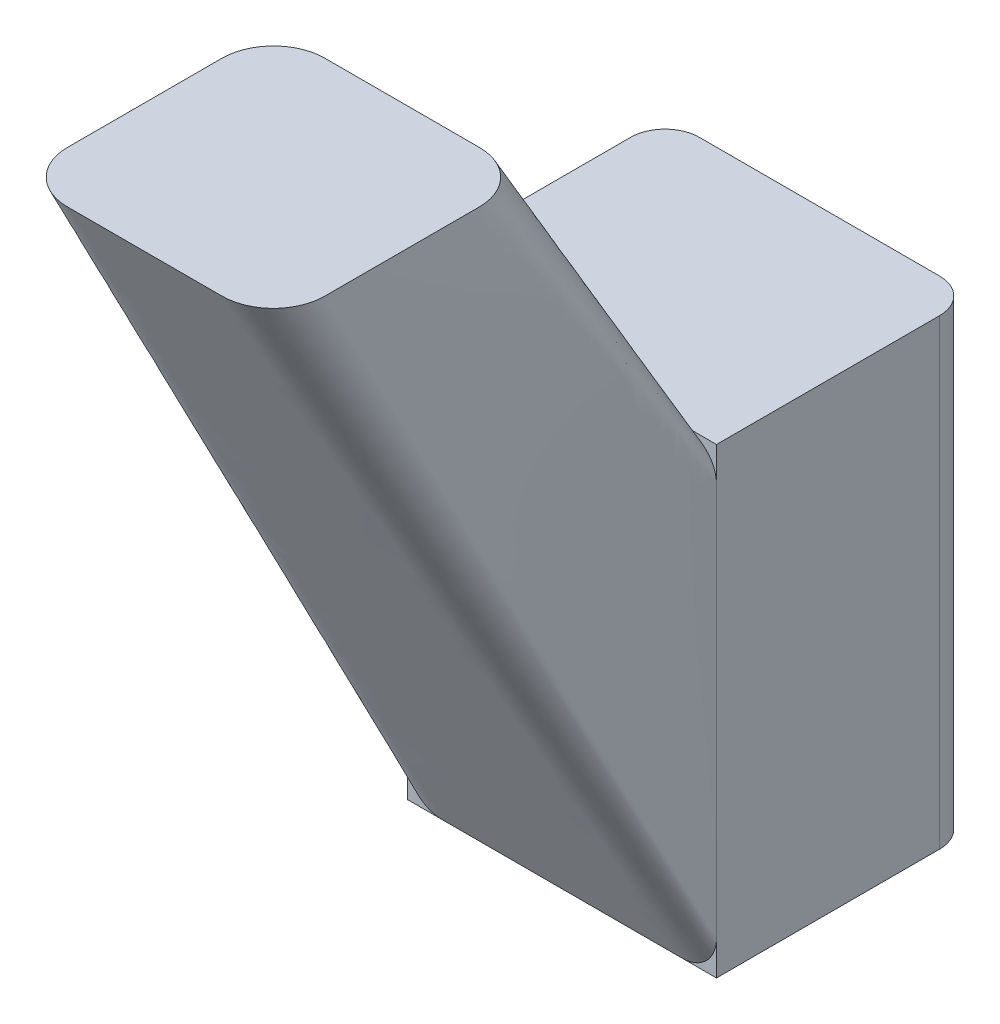
ISO-10303-21;
HEADER;
FILE_DESCRIPTION(('STEP AP214'),'2;1');
FILE_NAME('part.step','',(''),(''),'','','');
FILE_SCHEMA(('AUTOMOTIVE_DESIGN { 1 0 10303 214 1 1 1 1 }'));
ENDSEC;
DATA;
#1=APPLICATION_CONTEXT('core data for automotive mechanical design processes');
#2=APPLICATION_PROTOCOL_DEFINITION('international standard','automotive_design',2000,#1);
#3=PRODUCT_CONTEXT('',#1,'mechanical');
#4=PRODUCT('Part','Part','',(#3));
#5=PRODUCT_RELATED_PRODUCT_CATEGORY('part','',(#4));
#6=PRODUCT_DEFINITION_FORMATION('','',#4);
#7=PRODUCT_DEFINITION_CONTEXT('part definition',#1,'design');
#8=PRODUCT_DEFINITION('design','',#6,#7);
#9=PRODUCT_DEFINITION_SHAPE('','',#8);
#10=(LENGTH_UNIT() NAMED_UNIT(*) SI_UNIT(.MILLI.,.METRE.));
#11=(NAMED_UNIT(*) PLANE_ANGLE_UNIT() SI_UNIT($,.RADIAN.));
#12=(NAMED_UNIT(*) SI_UNIT($,.STERADIAN.) SOLID_ANGLE_UNIT());
#13=UNCERTAINTY_MEASURE_WITH_UNIT(LENGTH_MEASURE(1.E-05),#10,'distance_accuracy_value','');
#14=(GEOMETRIC_REPRESENTATION_CONTEXT(3) GLOBAL_UNCERTAINTY_ASSIGNED_CONTEXT((#13)) GLOBAL_UNIT_ASSIGNED_CONTEXT((#10,
#11,#12)) REPRESENTATION_CONTEXT('',''));
#15=CARTESIAN_POINT('',(0.,0.,0.));
#16=DIRECTION('',(0.,0.,1.));
#17=DIRECTION('',(1.,0.,0.));
#18=AXIS2_PLACEMENT_3D('',#15,#16,#17);
#19=CARTESIAN_POINT('',(0.,26.92,-9.));
#20=DIRECTION('',(0.,0.,-1.));
#21=DIRECTION('',(-1.,0.,0.));
#22=AXIS2_PLACEMENT_3D('',#19,#20,#21);
#23=PLANE('',#22);
#24=DIRECTION('',(0.,-1.,0.));
#25=VECTOR('',#24,1.);
#26=CARTESIAN_POINT('',(-9.,26.92,-9.));
#27=LINE('',#26,#25);
#28=CARTESIAN_POINT('',(-9.,26.92,-9.));
#29=VERTEX_POINT('',#28);
#30=CARTESIAN_POINT('',(-9.,24.92,-9.));
#31=VERTEX_POINT('',#30);
#32=EDGE_CURVE('E361',#29,#31,#27,.T.);
#33=ORIENTED_EDGE('',*,*,#32,.T.);
#34=CARTESIAN_POINT('',(-7.,24.92,-9.));
#35=DIRECTION('',(0.,0.,1.));
#36=DIRECTION('',(1.,0.,0.));
#37=AXIS2_PLACEMENT_3D('',#34,#35,#36);
#38=CIRCLE('',#37,2.);
#39=CARTESIAN_POINT('',(-6.99999999999999,26.92,-9.));
#40=VERTEX_POINT('',#39);
#41=EDGE_CURVE('E580',#40,#31,#38,.T.);
#42=ORIENTED_EDGE('',*,*,#41,.F.);
#43=DIRECTION('',(1.,0.,0.));
#44=VECTOR('',#43,1.);
#45=CARTESIAN_POINT('',(0.,26.92,-9.));
#46=LINE('',#45,#44);
#47=EDGE_CURVE('E320',#29,#40,#46,.T.);
#48=ORIENTED_EDGE('',*,*,#47,.F.);
#49=EDGE_LOOP('',(#33,#42,#48));
#50=FACE_BOUND('',#49,.T.);
#51=ADVANCED_FACE('F234',(#50),#23,.F.);
#52=CARTESIAN_POINT('',(6.99999999999999,26.92,-9.));
#53=VERTEX_POINT('',#52);
#54=CARTESIAN_POINT('',(9.,26.92,-9.));
#55=VERTEX_POINT('',#54);
#56=EDGE_CURVE('E304',#53,#55,#46,.T.);
#57=ORIENTED_EDGE('',*,*,#56,.F.);
#58=CARTESIAN_POINT('',(7.,24.92,-9.));
#59=DIRECTION('',(0.,0.,1.));
#60=DIRECTION('',(1.,0.,0.));
#61=AXIS2_PLACEMENT_3D('',#58,#59,#60);
#62=CIRCLE('',#61,2.);
#63=CARTESIAN_POINT('',(9.,24.92,-9.));
#64=VERTEX_POINT('',#63);
#65=EDGE_CURVE('E324',#64,#53,#62,.T.);
#66=ORIENTED_EDGE('',*,*,#65,.F.);
#67=DIRECTION('',(0.,-1.,0.));
#68=VECTOR('',#67,1.);
#69=CARTESIAN_POINT('',(9.,26.92,-9.));
#70=LINE('',#69,#68);
#71=EDGE_CURVE('E321',#55,#64,#70,.T.);
#72=ORIENTED_EDGE('',*,*,#71,.F.);
#73=EDGE_LOOP('',(#57,#66,#72));
#74=FACE_BOUND('',#73,.T.);
#75=ADVANCED_FACE('F325',(#74),#23,.F.);
#76=CARTESIAN_POINT('',(9.,2.00000000000001,-9.));
#77=VERTEX_POINT('',#76);
#78=CARTESIAN_POINT('',(9.,0.,-9.));
#79=VERTEX_POINT('',#78);
#80=EDGE_CURVE('E329',#77,#79,#70,.T.);
#81=ORIENTED_EDGE('',*,*,#80,.F.);
#82=CARTESIAN_POINT('',(7.,2.,-9.));
#83=DIRECTION('',(0.,0.,1.));
#84=DIRECTION('',(1.,0.,0.));
#85=AXIS2_PLACEMENT_3D('',#82,#83,#84);
#86=CIRCLE('',#85,2.);
#87=CARTESIAN_POINT('',(6.99999999999998,0.,-9.));
#88=VERTEX_POINT('',#87);
#89=EDGE_CURVE('E429',#88,#77,#86,.T.);
#90=ORIENTED_EDGE('',*,*,#89,.F.);
#91=DIRECTION('',(1.,0.,0.));
#92=VECTOR('',#91,1.);
#93=CARTESIAN_POINT('',(0.,0.,-9.));
#94=LINE('',#93,#92);
#95=EDGE_CURVE('E348',#88,#79,#94,.T.);
#96=ORIENTED_EDGE('',*,*,#95,.T.);
#97=EDGE_LOOP('',(#81,#90,#96));
#98=FACE_BOUND('',#97,.T.);
#99=ADVANCED_FACE('F393',(#98),#23,.F.);
#100=CARTESIAN_POINT('',(0.,26.92,-24.));
#101=DIRECTION('',(0.,0.,-1.));
#102=DIRECTION('',(-1.,0.,0.));
#103=AXIS2_PLACEMENT_3D('',#100,#101,#102);
#104=PLANE('',#103);
#105=DIRECTION('',(1.,0.,0.));
#106=VECTOR('',#105,1.);
#107=CARTESIAN_POINT('',(0.,0.,-24.));
#108=LINE('',#107,#106);
#109=CARTESIAN_POINT('',(-6.99999999999999,0.,-24.));
#110=VERTEX_POINT('',#109);
#111=CARTESIAN_POINT('',(6.99999999999999,0.,-24.));
#112=VERTEX_POINT('',#111);
#113=EDGE_CURVE('E345',#110,#112,#108,.T.);
#114=ORIENTED_EDGE('',*,*,#113,.F.);
#115=DIRECTION('',(0.,-1.,0.));
#116=VECTOR('',#115,1.);
#117=CARTESIAN_POINT('',(-6.99999999999999,26.92,-24.));
#118=LINE('',#117,#116);
#119=CARTESIAN_POINT('',(-6.99999999999999,26.92,-24.));
#120=VERTEX_POINT('',#119);
#121=EDGE_CURVE('E12',#120,#110,#118,.T.);
#122=ORIENTED_EDGE('',*,*,#121,.F.);
#123=DIRECTION('',(1.,0.,0.));
#124=VECTOR('',#123,1.);
#125=CARTESIAN_POINT('',(0.,26.92,-24.));
#126=LINE('',#125,#124);
#127=CARTESIAN_POINT('',(6.99999999999999,26.92,-24.));
#128=VERTEX_POINT('',#127);
#129=EDGE_CURVE('E379',#120,#128,#126,.T.);
#130=ORIENTED_EDGE('',*,*,#129,.T.);
#131=DIRECTION('',(0.,-1.,0.));
#132=VECTOR('',#131,1.);
#133=CARTESIAN_POINT('',(6.99999999999999,26.92,-24.));
#134=LINE('',#133,#132);
#135=EDGE_CURVE('E287',#128,#112,#134,.T.);
#136=ORIENTED_EDGE('',*,*,#135,.T.);
#137=EDGE_LOOP('',(#114,#122,#130,#136));
#138=FACE_BOUND('',#137,.T.);
#139=ADVANCED_FACE('F240',(#138),#104,.T.);
#140=CARTESIAN_POINT('',(-7.,26.92,-22.));
#141=DIRECTION('',(0.,-1.,0.));
#142=DIRECTION('',(0.,0.,-1.));
#143=AXIS2_PLACEMENT_3D('',#140,#141,#142);
#144=CYLINDRICAL_SURFACE('',#143,2.);
#145=CARTESIAN_POINT('',(-7.,0.,-22.));
#146=DIRECTION('',(0.,1.,0.));
#147=DIRECTION('',(0.,0.,1.));
#148=AXIS2_PLACEMENT_3D('',#145,#146,#147);
#149=CIRCLE('',#148,2.);
#150=CARTESIAN_POINT('',(-9.,0.,-22.));
#151=VERTEX_POINT('',#150);
#152=EDGE_CURVE('E344',#110,#151,#149,.T.);
#153=ORIENTED_EDGE('',*,*,#152,.T.);
#154=DIRECTION('',(0.,-1.,0.));
#155=VECTOR('',#154,1.);
#156=CARTESIAN_POINT('',(-9.,26.92,-22.));
#157=LINE('',#156,#155);
#158=CARTESIAN_POINT('',(-9.,26.92,-22.));
#159=VERTEX_POINT('',#158);
#160=EDGE_CURVE('E241',#159,#151,#157,.T.);
#161=ORIENTED_EDGE('',*,*,#160,.F.);
#162=CARTESIAN_POINT('',(-7.,26.92,-22.));
#163=DIRECTION('',(0.,1.,0.));
#164=DIRECTION('',(0.,0.,1.));
#165=AXIS2_PLACEMENT_3D('',#162,#163,#164);
#166=CIRCLE('',#165,2.);
#167=EDGE_CURVE('E381',#120,#159,#166,.T.);
#168=ORIENTED_EDGE('',*,*,#167,.F.);
#169=ORIENTED_EDGE('',*,*,#121,.T.);
#170=EDGE_LOOP('',(#153,#161,#168,#169));
#171=FACE_BOUND('',#170,.T.);
#172=ADVANCED_FACE('F395',(#171),#144,.T.);
#173=CARTESIAN_POINT('',(-9.,26.92,0.));
#174=DIRECTION('',(1.,0.,0.));
#175=DIRECTION('',(0.,0.,-1.));
#176=AXIS2_PLACEMENT_3D('',#173,#174,#175);
#177=PLANE('',#176);
#178=DIRECTION('',(0.,0.,1.));
#179=VECTOR('',#178,1.);
#180=CARTESIAN_POINT('',(-9.,0.,0.));
#181=LINE('',#180,#179);
#182=CARTESIAN_POINT('',(-9.,0.,-9.));
#183=VERTEX_POINT('',#182);
#184=EDGE_CURVE('E350',#151,#183,#181,.T.);
#185=ORIENTED_EDGE('',*,*,#184,.T.);
#186=CARTESIAN_POINT('',(-9.,2.00000000000002,-9.));
#187=VERTEX_POINT('',#186);
#188=EDGE_CURVE('E328',#187,#183,#27,.T.);
#189=ORIENTED_EDGE('',*,*,#188,.F.);
#190=DIRECTION('',(0.,-1.,0.));
#191=VECTOR('',#190,1.);
#192=CARTESIAN_POINT('',(-9.,24.92,-9.));
#193=LINE('',#192,#191);
#194=EDGE_CURVE('E239',#31,#187,#193,.T.);
#195=ORIENTED_EDGE('',*,*,#194,.F.);
#196=ORIENTED_EDGE('',*,*,#32,.F.);
#197=DIRECTION('',(0.,0.,1.));
#198=VECTOR('',#197,1.);
#199=CARTESIAN_POINT('',(-9.,26.92,0.));
#200=LINE('',#199,#198);
#201=EDGE_CURVE('E318',#159,#29,#200,.T.);
#202=ORIENTED_EDGE('',*,*,#201,.F.);
#203=ORIENTED_EDGE('',*,*,#160,.T.);
#204=EDGE_LOOP('',(#185,#189,#195,#196,#202,#203));
#205=FACE_BOUND('',#204,.T.);
#206=ADVANCED_FACE('F400',(#205),#177,.F.);
#207=CARTESIAN_POINT('',(-6.99999999999999,0.,-9.));
#208=VERTEX_POINT('',#207);
#209=EDGE_CURVE('E358',#183,#208,#94,.T.);
#210=ORIENTED_EDGE('',*,*,#209,.T.);
#211=CARTESIAN_POINT('',(-7.,2.,-9.));
#212=DIRECTION('',(0.,0.,1.));
#213=DIRECTION('',(1.,0.,0.));
#214=AXIS2_PLACEMENT_3D('',#211,#212,#213);
#215=CIRCLE('',#214,2.);
#216=EDGE_CURVE('E425',#187,#208,#215,.T.);
#217=ORIENTED_EDGE('',*,*,#216,.F.);
#218=ORIENTED_EDGE('',*,*,#188,.T.);
#219=EDGE_LOOP('',(#210,#217,#218));
#220=FACE_BOUND('',#219,.T.);
#221=ADVANCED_FACE('F405',(#220),#23,.F.);
#222=CARTESIAN_POINT('',(9.,26.92,0.));
#223=DIRECTION('',(1.,0.,0.));
#224=DIRECTION('',(0.,0.,-1.));
#225=AXIS2_PLACEMENT_3D('',#222,#223,#224);
#226=PLANE('',#225);
#227=DIRECTION('',(0.,0.,1.));
#228=VECTOR('',#227,1.);
#229=CARTESIAN_POINT('',(9.,0.,0.));
#230=LINE('',#229,#228);
#231=CARTESIAN_POINT('',(9.,0.,-22.));
#232=VERTEX_POINT('',#231);
#233=EDGE_CURVE('E353',#232,#79,#230,.T.);
#234=ORIENTED_EDGE('',*,*,#233,.F.);
#235=DIRECTION('',(0.,-1.,0.));
#236=VECTOR('',#235,1.);
#237=CARTESIAN_POINT('',(9.,26.92,-22.));
#238=LINE('',#237,#236);
#239=CARTESIAN_POINT('',(9.,26.92,-22.));
#240=VERTEX_POINT('',#239);
#241=EDGE_CURVE('E331',#240,#232,#238,.T.);
#242=ORIENTED_EDGE('',*,*,#241,.F.);
#243=DIRECTION('',(0.,0.,1.));
#244=VECTOR('',#243,1.);
#245=CARTESIAN_POINT('',(9.,26.92,0.));
#246=LINE('',#245,#244);
#247=EDGE_CURVE('E310',#240,#55,#246,.T.);
#248=ORIENTED_EDGE('',*,*,#247,.T.);
#249=ORIENTED_EDGE('',*,*,#71,.T.);
#250=DIRECTION('',(0.,1.,0.));
#251=VECTOR('',#250,1.);
#252=CARTESIAN_POINT('',(9.,2.00000000000001,-9.));
#253=LINE('',#252,#251);
#254=EDGE_CURVE('E459',#77,#64,#253,.T.);
#255=ORIENTED_EDGE('',*,*,#254,.F.);
#256=ORIENTED_EDGE('',*,*,#80,.T.);
#257=EDGE_LOOP('',(#234,#242,#248,#249,#255,#256));
#258=FACE_BOUND('',#257,.T.);
#259=ADVANCED_FACE('F334',(#258),#226,.T.);
#260=CARTESIAN_POINT('',(7.,26.92,-22.));
#261=DIRECTION('',(0.,-1.,0.));
#262=DIRECTION('',(0.,0.,-1.));
#263=AXIS2_PLACEMENT_3D('',#260,#261,#262);
#264=CYLINDRICAL_SURFACE('',#263,2.);
#265=CARTESIAN_POINT('',(7.,0.,-22.));
#266=DIRECTION('',(0.,1.,0.));
#267=DIRECTION('',(0.,0.,1.));
#268=AXIS2_PLACEMENT_3D('',#265,#266,#267);
#269=CIRCLE('',#268,2.);
#270=EDGE_CURVE('E377',#232,#112,#269,.T.);
#271=ORIENTED_EDGE('',*,*,#270,.T.);
#272=ORIENTED_EDGE('',*,*,#135,.F.);
#273=CARTESIAN_POINT('',(7.,26.92,-22.));
#274=DIRECTION('',(0.,1.,0.));
#275=DIRECTION('',(0.,0.,1.));
#276=AXIS2_PLACEMENT_3D('',#273,#274,#275);
#277=CIRCLE('',#276,2.);
#278=EDGE_CURVE('E265',#240,#128,#277,.T.);
#279=ORIENTED_EDGE('',*,*,#278,.F.);
#280=ORIENTED_EDGE('',*,*,#241,.T.);
#281=EDGE_LOOP('',(#271,#272,#279,#280));
#282=FACE_BOUND('',#281,.T.);
#283=ADVANCED_FACE('F416',(#282),#264,.T.);
#284=CARTESIAN_POINT('',(0.,26.92,0.));
#285=DIRECTION('',(0.,1.,0.));
#286=DIRECTION('',(0.,0.,1.));
#287=AXIS2_PLACEMENT_3D('',#284,#285,#286);
#288=PLANE('',#287);
#289=ORIENTED_EDGE('',*,*,#129,.F.);
#290=ORIENTED_EDGE('',*,*,#167,.T.);
#291=ORIENTED_EDGE('',*,*,#201,.T.);
#292=ORIENTED_EDGE('',*,*,#47,.T.);
#293=DIRECTION('',(-1.,0.,0.));
#294=VECTOR('',#293,1.);
#295=CARTESIAN_POINT('',(6.99999999999999,26.92,-9.));
#296=LINE('',#295,#294);
#297=EDGE_CURVE('E311',#53,#40,#296,.T.);
#298=ORIENTED_EDGE('',*,*,#297,.F.);
#299=ORIENTED_EDGE('',*,*,#56,.T.);
#300=ORIENTED_EDGE('',*,*,#247,.F.);
#301=ORIENTED_EDGE('',*,*,#278,.T.);
#302=EDGE_LOOP('',(#289,#290,#291,#292,#298,#299,#300,#301));
#303=FACE_BOUND('',#302,.T.);
#304=ADVANCED_FACE('F307',(#303),#288,.T.);
#305=CARTESIAN_POINT('',(0.,0.,0.));
#306=DIRECTION('',(0.,1.,0.));
#307=DIRECTION('',(0.,0.,1.));
#308=AXIS2_PLACEMENT_3D('',#305,#306,#307);
#309=PLANE('',#308);
#310=ORIENTED_EDGE('',*,*,#113,.T.);
#311=ORIENTED_EDGE('',*,*,#270,.F.);
#312=ORIENTED_EDGE('',*,*,#233,.T.);
#313=ORIENTED_EDGE('',*,*,#95,.F.);
#314=DIRECTION('',(1.,0.,0.));
#315=VECTOR('',#314,1.);
#316=CARTESIAN_POINT('',(-6.99999999999999,0.,-9.));
#317=LINE('',#316,#315);
#318=EDGE_CURVE('E422',#208,#88,#317,.T.);
#319=ORIENTED_EDGE('',*,*,#318,.F.);
#320=ORIENTED_EDGE('',*,*,#209,.F.);
#321=ORIENTED_EDGE('',*,*,#184,.F.);
#322=ORIENTED_EDGE('',*,*,#152,.F.);
#323=EDGE_LOOP('',(#310,#311,#312,#313,#319,#320,#321,#322));
#324=FACE_BOUND('',#323,.T.);
#325=ADVANCED_FACE('F387',(#324),#309,.F.);
#326=CARTESIAN_POINT('',(4.49999999999998,44.3163488855494,12.314167995012));
#327=DIRECTION('',(0.,1.,0.));
#328=DIRECTION('',(0.,0.,1.));
#329=AXIS2_PLACEMENT_3D('',#326,#327,#328);
#330=PLANE('',#329);
#331=DIRECTION('',(1.,0.,0.));
#332=VECTOR('',#331,1.);
#333=CARTESIAN_POINT('',(-4.50000000000001,44.3163488855494,15.314167995012));
#334=LINE('',#333,#332);
#335=CARTESIAN_POINT('',(-4.50000000000001,44.3163488855494,15.314167995012));
#336=VERTEX_POINT('',#335);
#337=CARTESIAN_POINT('',(4.50000000017771,44.3163488855494,15.314167995012));
#338=VERTEX_POINT('',#337);
#339=EDGE_CURVE('E660',#336,#338,#334,.T.);
#340=ORIENTED_EDGE('',*,*,#339,.T.);
#341=CARTESIAN_POINT('',(4.49999999999998,44.3163488855494,12.314167995012));
#342=DIRECTION('',(0.,1.,0.));
#343=DIRECTION('',(0.,0.,1.));
#344=AXIS2_PLACEMENT_3D('',#341,#342,#343);
#345=CIRCLE('',#344,3.00000000000002);
#346=CARTESIAN_POINT('',(7.5,44.3163488855494,12.3141679949729));
#347=VERTEX_POINT('',#346);
#348=EDGE_CURVE('E648',#338,#347,#345,.T.);
#349=ORIENTED_EDGE('',*,*,#348,.T.);
#350=DIRECTION('',(0.,0.,1.));
#351=VECTOR('',#350,1.);
#352=CARTESIAN_POINT('',(7.50000000000002,44.3163488855494,3.31416799501204));
#353=LINE('',#352,#351);
#354=CARTESIAN_POINT('',(7.50000000000001,44.3163488855494,3.31416799501199));
#355=VERTEX_POINT('',#354);
#356=EDGE_CURVE('E636',#355,#347,#353,.T.);
#357=ORIENTED_EDGE('',*,*,#356,.F.);
#358=CARTESIAN_POINT('',(4.49999999999998,44.3163488855494,3.31416799501203));
#359=DIRECTION('',(0.,1.,0.));
#360=DIRECTION('',(0.,0.,1.));
#361=AXIS2_PLACEMENT_3D('',#358,#359,#360);
#362=CIRCLE('',#361,3.00000000000002);
#363=CARTESIAN_POINT('',(4.49999999997396,44.3163488855494,0.31416799501202));
#364=VERTEX_POINT('',#363);
#365=EDGE_CURVE('E629',#355,#364,#362,.T.);
#366=ORIENTED_EDGE('',*,*,#365,.T.);
#367=DIRECTION('',(1.,0.,0.));
#368=VECTOR('',#367,1.);
#369=CARTESIAN_POINT('',(-4.50000000000001,44.3163488855494,0.31416799501203));
#370=LINE('',#369,#368);
#371=CARTESIAN_POINT('',(-4.50000000023795,44.3163488855494,0.314167995012029));
#372=VERTEX_POINT('',#371);
#373=EDGE_CURVE('E617',#372,#364,#370,.T.);
#374=ORIENTED_EDGE('',*,*,#373,.F.);
#375=CARTESIAN_POINT('',(-4.50000000000001,44.3163488855494,3.31416799501203));
#376=DIRECTION('',(0.,1.,0.));
#377=DIRECTION('',(0.,0.,1.));
#378=AXIS2_PLACEMENT_3D('',#375,#376,#377);
#379=CIRCLE('',#378,3.);
#380=CARTESIAN_POINT('',(-7.50000000000002,44.3163488855494,3.31416799505113));
#381=VERTEX_POINT('',#380);
#382=EDGE_CURVE('E613',#372,#381,#379,.T.);
#383=ORIENTED_EDGE('',*,*,#382,.T.);
#384=DIRECTION('',(0.,0.,1.));
#385=VECTOR('',#384,1.);
#386=CARTESIAN_POINT('',(-7.50000000000002,44.3163488855494,3.31416799501204));
#387=LINE('',#386,#385);
#388=CARTESIAN_POINT('',(-7.50000000000001,44.3163488855494,12.314167995012));
#389=VERTEX_POINT('',#388);
#390=EDGE_CURVE('E594',#381,#389,#387,.T.);
#391=ORIENTED_EDGE('',*,*,#390,.T.);
#392=CARTESIAN_POINT('',(-4.50000000000001,44.3163488855494,12.314167995012));
#393=DIRECTION('',(0.,1.,0.));
#394=DIRECTION('',(0.,0.,1.));
#395=AXIS2_PLACEMENT_3D('',#392,#393,#394);
#396=CIRCLE('',#395,3.);
#397=EDGE_CURVE('E591',#389,#336,#396,.T.);
#398=ORIENTED_EDGE('',*,*,#397,.T.);
#399=EDGE_LOOP('',(#340,#349,#357,#366,#374,#383,#391,#398));
#400=FACE_BOUND('',#399,.T.);
#401=ADVANCED_FACE('F446',(#400),#330,.T.);
#402=CARTESIAN_POINT('',(7.5,44.3163488855494,12.3141679946274));
#403=CARTESIAN_POINT('',(9.,2.00000000073104,-9.));
#404=CARTESIAN_POINT('',(7.5,44.3163488855494,12.3774916088361));
#405=CARTESIAN_POINT('',(9.,1.87964794236823,-9.));
#406=CARTESIAN_POINT('',(7.49605640023679,44.3163488855494,12.5086056600788));
#407=CARTESIAN_POINT('',(8.98105752412328,1.6930873485066,-9.00000000000001));
#408=CARTESIAN_POINT('',(7.47510161305542,44.3163488855493,12.7198304343241));
#409=CARTESIAN_POINT('',(8.93130305381148,1.4644314258121,-8.99999999999999));
#410=CARTESIAN_POINT('',(7.43589885009055,44.3163488855494,12.9467621325487));
#411=CARTESIAN_POINT('',(8.86555766633027,1.27090026483885,-9.00000000000001));
#412=CARTESIAN_POINT('',(7.3524735899007,44.3163488855495,13.2705519968583));
#413=CARTESIAN_POINT('',(8.76281667938774,1.04117131028361,-8.99999999999998));
#414=CARTESIAN_POINT('',(7.17698104323457,44.3163488855493,13.7155755173352));
#415=CARTESIAN_POINT('',(8.60883950419509,0.796794660482177,-9.));
#416=CARTESIAN_POINT('',(6.79776446874942,44.3163488855494,14.2901344857536));
#417=CARTESIAN_POINT('',(8.39040242361206,0.549563005825037,-9.));
#418=CARTESIAN_POINT('',(6.2293258135279,44.3163488855494,14.805150813765));
#419=CARTESIAN_POINT('',(8.13504014996132,0.342873441980374,-9.));
#420=CARTESIAN_POINT('',(5.58566122433072,44.3163488855493,15.1372973818365));
#421=CARTESIAN_POINT('',(7.84094399418161,0.173115362716335,-9.));
#422=CARTESIAN_POINT('',(4.99410408657728,44.3163488855494,15.2902686786646));
#423=CARTESIAN_POINT('',(7.48583638014426,0.0480313529431885,-9.));
#424=CARTESIAN_POINT('',(4.65580573027683,44.3163488855494,15.314167995012));
#425=CARTESIAN_POINT('',(7.19476973453134,0.,-9.));
#426=CARTESIAN_POINT('',(3.66891238088245,44.3163488855494,15.314167995012));
#427=CARTESIAN_POINT('',(5.96107341713146,0.,-9.));
#428=CARTESIAN_POINT('',(2.14586167394129,44.3163488855494,15.314167995012));
#429=CARTESIAN_POINT('',(3.72666091622539,0.,-9.00000000000001));
#430=CARTESIAN_POINT('',(0.,44.3163488855493,15.314167995012));
#431=CARTESIAN_POINT('',(0.,0.,-8.99999999999998));
#432=CARTESIAN_POINT('',(-2.14586167394129,44.3163488855494,15.314167995012));
#433=CARTESIAN_POINT('',(-3.7266609162254,0.,-9.00000000000002));
#434=CARTESIAN_POINT('',(-3.66891238088245,44.3163488855494,15.314167995012));
#435=CARTESIAN_POINT('',(-5.96107341713146,0.,-9.));
#436=CARTESIAN_POINT('',(-4.65580573027683,44.3163488855494,15.314167995012));
#437=CARTESIAN_POINT('',(-7.19476973453134,0.,-9.));
#438=CARTESIAN_POINT('',(-4.99410408657728,44.3163488855495,15.2902686786647));
#439=CARTESIAN_POINT('',(-7.48583638014427,0.0480313529431886,-9.));
#440=CARTESIAN_POINT('',(-5.58566122433071,44.3163488855492,15.1372973818364));
#441=CARTESIAN_POINT('',(-7.84094399418161,0.173115362716336,-9.));
#442=CARTESIAN_POINT('',(-6.22932581352792,44.3163488855495,14.805150813765));
#443=CARTESIAN_POINT('',(-8.13504014996132,0.342873441980378,-9.));
#444=CARTESIAN_POINT('',(-6.7977644687494,44.3163488855492,14.2901344857536));
#445=CARTESIAN_POINT('',(-8.39040242361207,0.549563005825043,-9.));
#446=CARTESIAN_POINT('',(-7.17698104323459,44.3163488855495,13.7155755173352));
#447=CARTESIAN_POINT('',(-8.60883950419511,0.796794660482188,-9.));
#448=CARTESIAN_POINT('',(-7.35247358990071,44.3163488855493,13.2705519968583));
#449=CARTESIAN_POINT('',(-8.76281667938773,1.04117131028361,-9.));
#450=CARTESIAN_POINT('',(-7.43589885009056,44.3163488855494,12.9467621325487));
#451=CARTESIAN_POINT('',(-8.86555766633029,1.27090026483887,-9.));
#452=CARTESIAN_POINT('',(-7.47510161305543,44.3163488855494,12.7198304343241));
#453=CARTESIAN_POINT('',(-8.93130305381148,1.46443142581211,-9.));
#454=CARTESIAN_POINT('',(-7.49605640023681,44.3163488855494,12.5086056600788));
#455=CARTESIAN_POINT('',(-8.98105752412329,1.69308734850661,-9.));
#456=CARTESIAN_POINT('',(-7.50000000000001,44.3163488855494,12.3774916088361));
#457=CARTESIAN_POINT('',(-9.,1.87964794236825,-9.));
#458=CARTESIAN_POINT('',(-7.50000000000001,44.3163488855494,11.4247633702577));
#459=CARTESIAN_POINT('',(-9.,3.69039115413977,-9.));
#460=CARTESIAN_POINT('',(-7.5,44.3163488855493,9.90326027450424));
#461=CARTESIAN_POINT('',(-8.99999999999999,7.33689555692173,-8.99999999999999));
#462=CARTESIAN_POINT('',(-7.50000000000003,44.3163488855494,7.81416799501205));
#463=CARTESIAN_POINT('',(-9.00000000000001,13.46,-9.00000000000001));
#464=CARTESIAN_POINT('',(-7.50000000000001,44.3163488855494,5.72507571551979));
#465=CARTESIAN_POINT('',(-8.99999999999999,19.5831044430782,-8.99999999999999));
#466=CARTESIAN_POINT('',(-7.50000000000002,44.3163488855494,4.20357261976634));
#467=CARTESIAN_POINT('',(-9.,23.2296088458602,-9.));
#468=CARTESIAN_POINT('',(-7.50000000000002,44.3163488855494,3.25084438118795));
#469=CARTESIAN_POINT('',(-9.,25.0403520576318,-9.));
#470=CARTESIAN_POINT('',(-7.49605640023681,44.3163488855494,3.11973032994529));
#471=CARTESIAN_POINT('',(-8.98105752412328,25.2269126514934,-9.));
#472=CARTESIAN_POINT('',(-7.47510161305543,44.3163488855494,2.90850555569994));
#473=CARTESIAN_POINT('',(-8.93130305381149,25.4555685741878,-9.));
#474=CARTESIAN_POINT('',(-7.43589885009056,44.3163488855494,2.68157385747538));
#475=CARTESIAN_POINT('',(-8.86555766633027,25.6490997351612,-9.));
#476=CARTESIAN_POINT('',(-7.35247358990071,44.3163488855493,2.35778399316581));
#477=CARTESIAN_POINT('',(-8.76281667938775,25.8788286897164,-8.99999999999999));
#478=CARTESIAN_POINT('',(-7.17698104323458,44.3163488855494,1.91276047268884));
#479=CARTESIAN_POINT('',(-8.60883950419511,26.1232053395178,-9.00000000000002));
#480=CARTESIAN_POINT('',(-6.79776446874943,44.3163488855493,1.33820150427042));
#481=CARTESIAN_POINT('',(-8.39040242361206,26.370436994175,-8.99999999999998));
#482=CARTESIAN_POINT('',(-6.22932581352789,44.3163488855494,0.82318517625905));
#483=CARTESIAN_POINT('',(-8.13504014996134,26.5771265580196,-9.00000000000001));
#484=CARTESIAN_POINT('',(-5.58566122433074,44.3163488855494,0.491038608187588));
#485=CARTESIAN_POINT('',(-7.8409439941816,26.7468846372837,-9.));
#486=CARTESIAN_POINT('',(-4.99410408657726,44.3163488855493,0.338067311359428));
#487=CARTESIAN_POINT('',(-7.48583638014427,26.8719686470568,-9.));
#488=CARTESIAN_POINT('',(-4.65580573027683,44.3163488855494,0.314167995012028));
#489=CARTESIAN_POINT('',(-7.19476973453134,26.92,-9.));
#490=CARTESIAN_POINT('',(-3.66891238088244,44.3163488855494,0.31416799501203));
#491=CARTESIAN_POINT('',(-5.96107341713146,26.92,-9.));
#492=CARTESIAN_POINT('',(-2.14586167394128,44.3163488855493,0.314167995012031));
#493=CARTESIAN_POINT('',(-3.7266609162254,26.92,-9.));
#494=CARTESIAN_POINT('',(0.,44.3163488855494,0.314167995012032));
#495=CARTESIAN_POINT('',(0.,26.92,-8.99999999999999));
#496=CARTESIAN_POINT('',(2.1458616739413,44.3163488855494,0.314167995012032));
#497=CARTESIAN_POINT('',(3.7266609162254,26.92,-9.));
#498=CARTESIAN_POINT('',(3.66891238088245,44.3163488855494,0.314167995012033));
#499=CARTESIAN_POINT('',(5.96107341713146,26.92,-9.));
#500=CARTESIAN_POINT('',(4.65580573027683,44.3163488855494,0.314167995012018));
#501=CARTESIAN_POINT('',(7.19476973453134,26.92,-9.));
#502=CARTESIAN_POINT('',(4.99410408657728,44.3163488855494,0.33806731135942));
#503=CARTESIAN_POINT('',(7.48583638014427,26.8719686470568,-9.));
#504=CARTESIAN_POINT('',(5.58566122433072,44.3163488855494,0.491038608187585));
#505=CARTESIAN_POINT('',(7.8409439941816,26.7468846372837,-8.99999999999999));
#506=CARTESIAN_POINT('',(6.22932581352791,44.3163488855493,0.823185176259055));
#507=CARTESIAN_POINT('',(8.13504014996133,26.5771265580196,-9.00000000000001));
#508=CARTESIAN_POINT('',(6.79776446874941,44.3163488855494,1.33820150427042));
#509=CARTESIAN_POINT('',(8.39040242361207,26.370436994175,-8.99999999999999));
#510=CARTESIAN_POINT('',(7.17698104323457,44.3163488855493,1.91276047268885));
#511=CARTESIAN_POINT('',(8.60883950419509,26.1232053395178,-9.00000000000001));
#512=CARTESIAN_POINT('',(7.3524735899007,44.3163488855494,2.35778399316581));
#513=CARTESIAN_POINT('',(8.76281667938777,25.8788286897164,-8.99999999999999));
#514=CARTESIAN_POINT('',(7.43589885009055,44.3163488855494,2.68157385747538));
#515=CARTESIAN_POINT('',(8.86555766633025,25.6490997351611,-9.00000000000001));
#516=CARTESIAN_POINT('',(7.47510161305542,44.3163488855494,2.90850555569994));
#517=CARTESIAN_POINT('',(8.93130305381151,25.4555685741879,-8.99999999999999));
#518=CARTESIAN_POINT('',(7.4960564002368,44.3163488855494,3.11973032994529));
#519=CARTESIAN_POINT('',(8.98105752412327,25.2269126514934,-9.));
#520=CARTESIAN_POINT('',(7.5,44.3163488855494,3.25084438118795));
#521=CARTESIAN_POINT('',(9.,25.0403520576318,-9.));
#522=CARTESIAN_POINT('',(7.50000000000002,44.3163488855494,4.20357261976634));
#523=CARTESIAN_POINT('',(9.,23.2296088458602,-9.));
#524=CARTESIAN_POINT('',(7.50000000000001,44.3163488855493,5.7250757155198));
#525=CARTESIAN_POINT('',(8.99999999999998,19.5831044430782,-8.99999999999998));
#526=CARTESIAN_POINT('',(7.50000000000003,44.3163488855494,7.81416799501203));
#527=CARTESIAN_POINT('',(9.00000000000003,13.46,-9.00000000000003));
#528=CARTESIAN_POINT('',(7.50000000000001,44.3163488855494,9.90326027450425));
#529=CARTESIAN_POINT('',(8.99999999999997,7.33689555692173,-8.99999999999997));
#530=CARTESIAN_POINT('',(7.50000000000002,44.3163488855494,11.4247633702577));
#531=CARTESIAN_POINT('',(9.,3.69039115413976,-9.));
#532=CARTESIAN_POINT('',(7.5,44.3163488855494,12.3141679946274));
#533=CARTESIAN_POINT('',(9.,2.00000000073104,-9.));
#534=B_SPLINE_SURFACE_WITH_KNOTS('',3,1,((#402,#403),(#404,#405),(#406,#407),(#408,#409),(#410,
#411),(#412,#413),(#414,#415),(#416,#417),(#418,#419),(#420,#421),(#422,#423),(#424,#425),(#426,
#427),(#428,#429),(#430,#431),(#432,#433),(#434,#435),(#436,#437),(#438,#439),(#440,#441),(#442,
#443),(#444,#445),(#446,#447),(#448,#449),(#450,#451),(#452,#453),(#454,#455),(#456,#457),(#458,
#459),(#460,#461),(#462,#463),(#464,#465),(#466,#467),(#468,#469),(#470,#471),(#472,#473),(#474,
#475),(#476,#477),(#478,#479),(#480,#481),(#482,#483),(#484,#485),(#486,#487),(#488,#489),(#490,
#491),(#492,#493),(#494,#495),(#496,#497),(#498,#499),(#500,#501),(#502,#503),(#504,#505),(#506,
#507),(#508,#509),(#510,#511),(#512,#513),(#514,#515),(#516,#517),(#518,#519),(#520,#521),(#522,
#523),(#524,#525),(#526,#527),(#528,#529),(#530,#531),(#532,#533)),.UNSPECIFIED.,.T.,.F.,.F.,(4,
1,1,1,1,1,1,1,1,1,2,1,1,1,2,1,1,1,1,1,1,1,1,1,2,1,1,1,2,1,1,1,1,1,1,1,1,1,2,1,1,1,2,1,1,1,1,1,1,
1,1,1,2,1,1,1,4),(2,2),(0.,0.00382103598998593,0.00764207197997185,0.0114631079699578,
0.0152841439599437,0.0229262159399156,0.0305682879198874,0.0382103598998593,0.0458524318798311,
0.053494503859803,0.0611365758397748,0.101900361320263,0.142664146800752,0.183427932281241,
0.224191717761729,0.231833789741701,0.239475861721673,0.247117933701645,0.254760005681617,
0.262402077661589,0.270044149641561,0.273865185631546,0.277686221621532,0.281507257611518,
0.285328293601504,0.338996220201128,0.392664146800752,0.446332073400376,0.5,0.503821035989986,
0.507642071979972,0.511463107969958,0.515284143959944,0.522926215939916,0.530568287919888,
0.538210359899859,0.545852431879831,0.553494503859803,0.561136575839775,0.601900361320264,
0.642664146800752,0.683427932281241,0.72419171776173,0.731833789741701,0.739475861721673,
0.747117933701645,0.754760005681617,0.762402077661589,0.770044149641561,0.773865185631547,
0.777686221621533,0.781507257611519,0.785328293601504,0.838996220201128,0.892664146800752,
0.946332073400376,1.),(0.,1.),.UNSPECIFIED.);
#535=CARTESIAN_POINT('',(-7.50000000000002,44.3163488855494,7.81416799501203));
#536=CARTESIAN_POINT('',(-9.,13.46,-9.));
#537=CARTESIAN_POINT('',(-7.50000000000002,44.3163488855494,7.11780390184796));
#538=CARTESIAN_POINT('',(-9.,15.5010348143594,-9.));
#539=CARTESIAN_POINT('',(-7.50000000000001,44.3163488855494,5.72507571551979));
#540=CARTESIAN_POINT('',(-8.99999999999999,19.5831044430782,-8.99999999999999));
#541=CARTESIAN_POINT('',(-7.50000000000002,44.3163488855494,4.20357261976634));
#542=CARTESIAN_POINT('',(-9.,23.2296088458602,-9.));
#543=CARTESIAN_POINT('',(-7.50000000000002,44.3163488855494,3.25084438118795));
#544=CARTESIAN_POINT('',(-9.,25.0403520576318,-9.));
#545=CARTESIAN_POINT('',(-7.49605640023681,44.3163488855494,3.11973032994529));
#546=CARTESIAN_POINT('',(-8.98105752412328,25.2269126514934,-9.));
#547=CARTESIAN_POINT('',(-7.47510161305543,44.3163488855494,2.90850555569994));
#548=CARTESIAN_POINT('',(-8.93130305381149,25.4555685741878,-9.));
#549=CARTESIAN_POINT('',(-7.43589885009056,44.3163488855494,2.68157385747538));
#550=CARTESIAN_POINT('',(-8.86555766633027,25.6490997351612,-9.));
#551=CARTESIAN_POINT('',(-7.35247358990071,44.3163488855493,2.35778399316581));
#552=CARTESIAN_POINT('',(-8.76281667938775,25.8788286897164,-8.99999999999999));
#553=CARTESIAN_POINT('',(-7.17698104323458,44.3163488855494,1.91276047268884));
#554=CARTESIAN_POINT('',(-8.60883950419511,26.1232053395178,-9.00000000000002));
#555=CARTESIAN_POINT('',(-6.79776446874943,44.3163488855493,1.33820150427042));
#556=CARTESIAN_POINT('',(-8.39040242361206,26.370436994175,-8.99999999999998));
#557=CARTESIAN_POINT('',(-6.22932581352789,44.3163488855494,0.82318517625905));
#558=CARTESIAN_POINT('',(-8.13504014996134,26.5771265580196,-9.00000000000001));
#559=CARTESIAN_POINT('',(-5.58566122433074,44.3163488855494,0.491038608187588));
#560=CARTESIAN_POINT('',(-7.8409439941816,26.7468846372837,-9.));
#561=CARTESIAN_POINT('',(-4.99410408657726,44.3163488855493,0.338067311359428));
#562=CARTESIAN_POINT('',(-7.48583638014427,26.8719686470568,-9.));
#563=CARTESIAN_POINT('',(-4.65580573027683,44.3163488855494,0.314167995012028));
#564=CARTESIAN_POINT('',(-7.19476973453134,26.92,-9.));
#565=CARTESIAN_POINT('',(-3.66891238088244,44.3163488855494,0.31416799501203));
#566=CARTESIAN_POINT('',(-5.96107341713146,26.92,-9.));
#567=CARTESIAN_POINT('',(-2.14586167394128,44.3163488855493,0.314167995012031));
#568=CARTESIAN_POINT('',(-3.7266609162254,26.92,-9.));
#569=CARTESIAN_POINT('',(0.,44.3163488855494,0.314167995012032));
#570=CARTESIAN_POINT('',(0.,26.92,-8.99999999999999));
#571=CARTESIAN_POINT('',(2.1458616739413,44.3163488855494,0.314167995012032));
#572=CARTESIAN_POINT('',(3.7266609162254,26.92,-9.));
#573=CARTESIAN_POINT('',(3.66891238088245,44.3163488855494,0.314167995012033));
#574=CARTESIAN_POINT('',(5.96107341713146,26.92,-9.));
#575=CARTESIAN_POINT('',(4.65580573027683,44.3163488855494,0.314167995012018));
#576=CARTESIAN_POINT('',(7.19476973453134,26.92,-9.));
#577=CARTESIAN_POINT('',(4.99410408657728,44.3163488855494,0.33806731135942));
#578=CARTESIAN_POINT('',(7.48583638014427,26.8719686470568,-9.));
#579=CARTESIAN_POINT('',(5.58566122433072,44.3163488855494,0.491038608187585));
#580=CARTESIAN_POINT('',(7.8409439941816,26.7468846372837,-8.99999999999999));
#581=CARTESIAN_POINT('',(6.22932581352791,44.3163488855493,0.823185176259055));
#582=CARTESIAN_POINT('',(8.13504014996133,26.5771265580196,-9.00000000000001));
#583=CARTESIAN_POINT('',(6.79776446874941,44.3163488855494,1.33820150427042));
#584=CARTESIAN_POINT('',(8.39040242361207,26.370436994175,-8.99999999999999));
#585=CARTESIAN_POINT('',(7.17698104323457,44.3163488855493,1.91276047268885));
#586=CARTESIAN_POINT('',(8.60883950419509,26.1232053395178,-9.00000000000001));
#587=CARTESIAN_POINT('',(7.3524735899007,44.3163488855494,2.35778399316581));
#588=CARTESIAN_POINT('',(8.76281667938777,25.8788286897164,-8.99999999999999));
#589=CARTESIAN_POINT('',(7.43589885009055,44.3163488855494,2.68157385747538));
#590=CARTESIAN_POINT('',(8.86555766633025,25.6490997351611,-9.00000000000001));
#591=CARTESIAN_POINT('',(7.47510161305542,44.3163488855494,2.90850555569994));
#592=CARTESIAN_POINT('',(8.93130305381151,25.4555685741879,-8.99999999999999));
#593=CARTESIAN_POINT('',(7.4960564002368,44.3163488855494,3.11973032994529));
#594=CARTESIAN_POINT('',(8.98105752412327,25.2269126514934,-9.));
#595=CARTESIAN_POINT('',(7.5,44.3163488855494,3.25084438118795));
#596=CARTESIAN_POINT('',(9.,25.0403520576318,-9.));
#597=CARTESIAN_POINT('',(7.50000000000002,44.3163488855494,4.20357261976634));
#598=CARTESIAN_POINT('',(9.,23.2296088458602,-9.));
#599=CARTESIAN_POINT('',(7.50000000000001,44.3163488855493,5.7250757155198));
#600=CARTESIAN_POINT('',(8.99999999999998,19.5831044430782,-8.99999999999998));
#601=CARTESIAN_POINT('',(7.50000000000003,44.3163488855494,7.81416799501203));
#602=CARTESIAN_POINT('',(9.00000000000003,13.46,-9.00000000000003));
#603=CARTESIAN_POINT('',(7.50000000000001,44.3163488855494,9.90326027450425));
#604=CARTESIAN_POINT('',(8.99999999999997,7.33689555692173,-8.99999999999997));
#605=CARTESIAN_POINT('',(7.50000000000002,44.3163488855494,11.4247633702577));
#606=CARTESIAN_POINT('',(9.,3.69039115413976,-9.));
#607=CARTESIAN_POINT('',(7.5,44.3163488855494,12.3774916088361));
#608=CARTESIAN_POINT('',(9.,1.87964794236823,-9.));
#609=CARTESIAN_POINT('',(7.49605640023679,44.3163488855494,12.5086056600788));
#610=CARTESIAN_POINT('',(8.98105752412328,1.6930873485066,-9.00000000000001));
#611=CARTESIAN_POINT('',(7.47510161305542,44.3163488855493,12.7198304343241));
#612=CARTESIAN_POINT('',(8.93130305381148,1.4644314258121,-8.99999999999999));
#613=CARTESIAN_POINT('',(7.43589885009055,44.3163488855494,12.9467621325487));
#614=CARTESIAN_POINT('',(8.86555766633027,1.27090026483885,-9.00000000000001));
#615=CARTESIAN_POINT('',(7.3524735899007,44.3163488855495,13.2705519968583));
#616=CARTESIAN_POINT('',(8.76281667938774,1.04117131028361,-8.99999999999998));
#617=CARTESIAN_POINT('',(7.17698104323457,44.3163488855493,13.7155755173352));
#618=CARTESIAN_POINT('',(8.60883950419509,0.796794660482177,-9.));
#619=CARTESIAN_POINT('',(6.79776446874942,44.3163488855494,14.2901344857536));
#620=CARTESIAN_POINT('',(8.39040242361206,0.549563005825037,-9.));
#621=CARTESIAN_POINT('',(6.2293258135279,44.3163488855494,14.805150813765));
#622=CARTESIAN_POINT('',(8.13504014996132,0.342873441980374,-9.));
#623=CARTESIAN_POINT('',(5.58566122433072,44.3163488855493,15.1372973818365));
#624=CARTESIAN_POINT('',(7.84094399418161,0.173115362716335,-9.));
#625=CARTESIAN_POINT('',(4.99410408657728,44.3163488855494,15.2902686786646));
#626=CARTESIAN_POINT('',(7.48583638014426,0.0480313529431885,-9.));
#627=CARTESIAN_POINT('',(4.65580573027683,44.3163488855494,15.314167995012));
#628=CARTESIAN_POINT('',(7.19476973453134,0.,-9.));
#629=CARTESIAN_POINT('',(3.66891238088245,44.3163488855494,15.314167995012));
#630=CARTESIAN_POINT('',(5.96107341713146,0.,-9.));
#631=CARTESIAN_POINT('',(2.14586167394129,44.3163488855494,15.314167995012));
#632=CARTESIAN_POINT('',(3.72666091622539,0.,-9.00000000000001));
#633=CARTESIAN_POINT('',(0.,44.3163488855493,15.314167995012));
#634=CARTESIAN_POINT('',(0.,0.,-8.99999999999998));
#635=CARTESIAN_POINT('',(-2.14586167394129,44.3163488855494,15.314167995012));
#636=CARTESIAN_POINT('',(-3.7266609162254,0.,-9.00000000000002));
#637=CARTESIAN_POINT('',(-3.66891238088245,44.3163488855494,15.314167995012));
#638=CARTESIAN_POINT('',(-5.96107341713146,0.,-9.));
#639=CARTESIAN_POINT('',(-4.65580573027683,44.3163488855494,15.314167995012));
#640=CARTESIAN_POINT('',(-7.19476973453134,0.,-9.));
#641=CARTESIAN_POINT('',(-4.99410408657728,44.3163488855495,15.2902686786647));
#642=CARTESIAN_POINT('',(-7.48583638014427,0.0480313529431886,-9.));
#643=CARTESIAN_POINT('',(-5.58566122433071,44.3163488855492,15.1372973818364));
#644=CARTESIAN_POINT('',(-7.84094399418161,0.173115362716336,-9.));
#645=CARTESIAN_POINT('',(-6.22932581352792,44.3163488855495,14.805150813765));
#646=CARTESIAN_POINT('',(-8.13504014996132,0.342873441980378,-9.));
#647=CARTESIAN_POINT('',(-6.7977644687494,44.3163488855492,14.2901344857536));
#648=CARTESIAN_POINT('',(-8.39040242361207,0.549563005825043,-9.));
#649=CARTESIAN_POINT('',(-7.17698104323459,44.3163488855495,13.7155755173352));
#650=CARTESIAN_POINT('',(-8.60883950419511,0.796794660482188,-9.));
#651=CARTESIAN_POINT('',(-7.35247358990071,44.3163488855493,13.2705519968583));
#652=CARTESIAN_POINT('',(-8.76281667938773,1.04117131028361,-9.));
#653=CARTESIAN_POINT('',(-7.43589885009056,44.3163488855494,12.9467621325487));
#654=CARTESIAN_POINT('',(-8.86555766633029,1.27090026483887,-9.));
#655=CARTESIAN_POINT('',(-7.47510161305543,44.3163488855494,12.7198304343241));
#656=CARTESIAN_POINT('',(-8.93130305381148,1.46443142581211,-9.));
#657=CARTESIAN_POINT('',(-7.49605640023681,44.3163488855494,12.5086056600788));
#658=CARTESIAN_POINT('',(-8.98105752412329,1.69308734850661,-9.));
#659=CARTESIAN_POINT('',(-7.50000000000001,44.3163488855494,12.3774916088361));
#660=CARTESIAN_POINT('',(-9.,1.87964794236825,-9.));
#661=CARTESIAN_POINT('',(-7.50000000000001,44.3163488855494,11.4247633702577));
#662=CARTESIAN_POINT('',(-9.,3.69039115413977,-9.));
#663=CARTESIAN_POINT('',(-7.5,44.3163488855493,9.90326027450424));
#664=CARTESIAN_POINT('',(-8.99999999999999,7.33689555692173,-8.99999999999999));
#665=CARTESIAN_POINT('',(-7.50000000000002,44.3163488855494,8.51053208817611));
#666=CARTESIAN_POINT('',(-9.,11.4189651856406,-9.));
#667=CARTESIAN_POINT('',(-7.50000000000002,44.3163488855494,7.81416799501203));
#668=CARTESIAN_POINT('',(-9.,13.46,-9.));
#669=B_SPLINE_SURFACE_WITH_KNOTS('',3,1,((#535,#536),(#537,#538),(#539,#540),(#541,#542),(#543,
#544),(#545,#546),(#547,#548),(#549,#550),(#551,#552),(#553,#554),(#555,#556),(#557,#558),(#559,
#560),(#561,#562),(#563,#564),(#565,#566),(#567,#568),(#569,#570),(#571,#572),(#573,#574),(#575,
#576),(#577,#578),(#579,#580),(#581,#582),(#583,#584),(#585,#586),(#587,#588),(#589,#590),(#591,
#592),(#593,#594),(#595,#596),(#597,#598),(#599,#600),(#601,#602),(#603,#604),(#605,#606),(#607,
#608),(#609,#610),(#611,#612),(#613,#614),(#615,#616),(#617,#618),(#619,#620),(#621,#622),(#623,
#624),(#625,#626),(#627,#628),(#629,#630),(#631,#632),(#633,#634),(#635,#636),(#637,#638),(#639,
#640),(#641,#642),(#643,#644),(#645,#646),(#647,#648),(#649,#650),(#651,#652),(#653,#654),(#655,
#656),(#657,#658),(#659,#660),(#661,#662),(#663,#664),(#665,#666),(#667,#668)),.UNSPECIFIED.,
.T.,.F.,.F.,(4,1,2,1,1,1,1,1,1,1,1,1,2,1,1,1,2,1,1,1,1,1,1,1,1,1,2,1,1,1,2,1,1,1,1,1,1,1,1,1,2,
1,1,1,2,1,1,1,1,1,1,1,1,1,2,1,4),(2,2),(0.392664146800752,0.446332073400376,0.5,
0.503821035989986,0.507642071979972,0.511463107969958,0.515284143959944,0.522926215939916,
0.530568287919888,0.538210359899859,0.545852431879831,0.553494503859803,0.561136575839775,
0.601900361320264,0.642664146800752,0.683427932281241,0.72419171776173,0.731833789741701,
0.739475861721673,0.747117933701645,0.754760005681617,0.762402077661589,0.770044149641561,
0.773865185631547,0.777686221621533,0.781507257611519,0.785328293601504,0.838996220201128,
0.892664146800752,0.946332073400376,1.,1.00382103598999,1.00764207197997,1.01146310796996,
1.01528414395994,1.02292621593992,1.03056828791989,1.03821035989986,1.04585243187983,
1.0534945038598,1.06113657583977,1.10190036132026,1.14266414680075,1.18342793228124,
1.22419171776173,1.2318337897417,1.23947586172167,1.24711793370164,1.25476000568162,
1.26240207766159,1.27004414964156,1.27386518563155,1.27768622162153,1.28150725761152,
1.2853282936015,1.33899622020113,1.39266414680075),(0.,1.),.UNSPECIFIED.);
#670=ORIENTED_EDGE('',*,*,#390,.F.);
#671=ORIENTED_EDGE('',*,*,#382,.F.);
#672=ORIENTED_EDGE('',*,*,#373,.T.);
#673=ORIENTED_EDGE('',*,*,#365,.F.);
#674=ORIENTED_EDGE('',*,*,#356,.T.);
#675=ORIENTED_EDGE('',*,*,#348,.F.);
#676=ORIENTED_EDGE('',*,*,#339,.F.);
#677=ORIENTED_EDGE('',*,*,#397,.F.);
#678=EDGE_LOOP('',(#670,#671,#672,#673,#674,#675,#676,#677));
#679=FACE_BOUND('',#678,.T.);
#680=ORIENTED_EDGE('',*,*,#297,.T.);
#681=ORIENTED_EDGE('',*,*,#41,.T.);
#682=ORIENTED_EDGE('',*,*,#194,.T.);
#683=ORIENTED_EDGE('',*,*,#216,.T.);
#684=ORIENTED_EDGE('',*,*,#318,.T.);
#685=ORIENTED_EDGE('',*,*,#89,.T.);
#686=ORIENTED_EDGE('',*,*,#254,.T.);
#687=ORIENTED_EDGE('',*,*,#65,.T.);
#688=EDGE_LOOP('',(#680,#681,#682,#683,#684,#685,#686,#687));
#689=FACE_BOUND('',#688,.T.);
#690=ADVANCED_FACE('F480',(#679,#689),#669,.T.);
#691=CLOSED_SHELL('',(#51,#75,#99,#139,#172,#206,#221,#259,#283,#304,#325,#401,#690));
#692=MANIFOLD_SOLID_BREP('B2',#691);
#693=ADVANCED_BREP_SHAPE_REPRESENTATION('',(#18,#692),#14);
#694=SHAPE_DEFINITION_REPRESENTATION(#9,#693);
ENDSEC;
END-ISO-10303-21;
